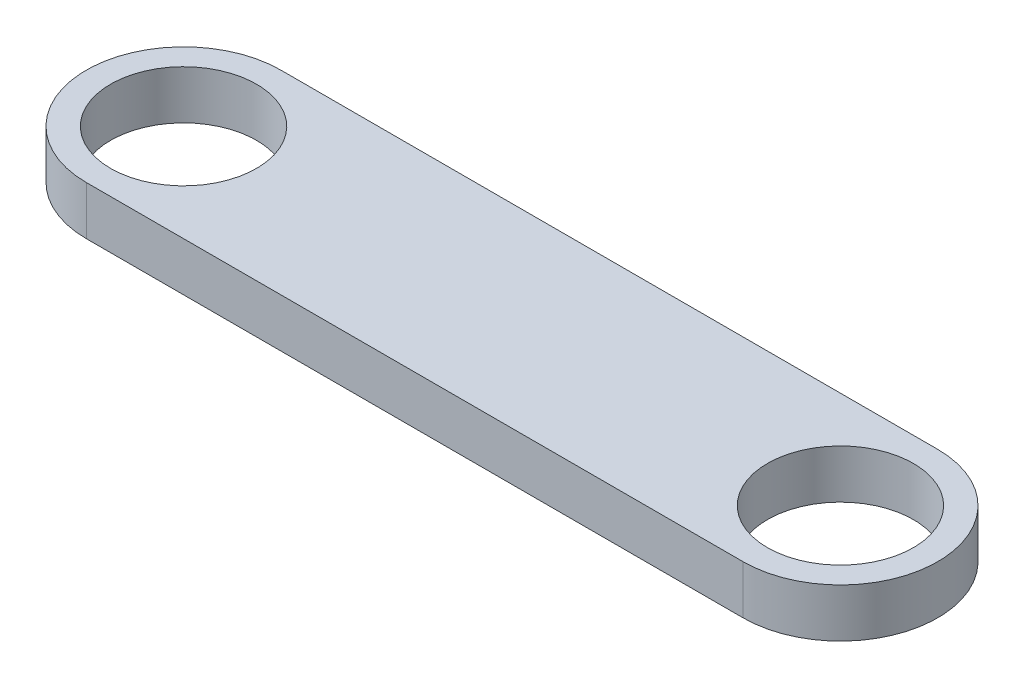
ISO-10303-21;
HEADER;
FILE_DESCRIPTION(('STEP AP214'),'2;1');
FILE_NAME('part.step','',(''),(''),'','','');
FILE_SCHEMA(('AUTOMOTIVE_DESIGN { 1 0 10303 214 1 1 1 1 }'));
ENDSEC;
DATA;
#1=APPLICATION_CONTEXT('core data for automotive mechanical design processes');
#2=APPLICATION_PROTOCOL_DEFINITION('international standard','automotive_design',2000,#1);
#3=PRODUCT_CONTEXT('',#1,'mechanical');
#4=PRODUCT('Part','Part','',(#3));
#5=PRODUCT_RELATED_PRODUCT_CATEGORY('part','',(#4));
#6=PRODUCT_DEFINITION_FORMATION('','',#4);
#7=PRODUCT_DEFINITION_CONTEXT('part definition',#1,'design');
#8=PRODUCT_DEFINITION('design','',#6,#7);
#9=PRODUCT_DEFINITION_SHAPE('','',#8);
#10=(LENGTH_UNIT() NAMED_UNIT(*) SI_UNIT(.MILLI.,.METRE.));
#11=(NAMED_UNIT(*) PLANE_ANGLE_UNIT() SI_UNIT($,.RADIAN.));
#12=(NAMED_UNIT(*) SI_UNIT($,.STERADIAN.) SOLID_ANGLE_UNIT());
#13=UNCERTAINTY_MEASURE_WITH_UNIT(LENGTH_MEASURE(1.E-05),#10,'distance_accuracy_value','');
#14=(GEOMETRIC_REPRESENTATION_CONTEXT(3) GLOBAL_UNCERTAINTY_ASSIGNED_CONTEXT((#13)) GLOBAL_UNIT_ASSIGNED_CONTEXT((#10,
#11,#12)) REPRESENTATION_CONTEXT('',''));
#15=CARTESIAN_POINT('',(0.,0.,0.));
#16=DIRECTION('',(0.,0.,1.));
#17=DIRECTION('',(1.,0.,0.));
#18=AXIS2_PLACEMENT_3D('',#15,#16,#17);
#19=CARTESIAN_POINT('',(-134.186746987952,10.,0.));
#20=DIRECTION('',(0.,1.,0.));
#21=DIRECTION('',(0.,0.,1.));
#22=AXIS2_PLACEMENT_3D('',#19,#20,#21);
#23=PLANE('',#22);
#24=CARTESIAN_POINT('',(0.813253012048182,10.,0.));
#25=DIRECTION('',(0.,1.,0.));
#26=DIRECTION('',(0.,0.,1.));
#27=AXIS2_PLACEMENT_3D('',#24,#25,#26);
#28=CIRCLE('',#27,15.);
#29=CARTESIAN_POINT('',(0.813253012048182,10.,15.));
#30=VERTEX_POINT('',#29);
#31=EDGE_CURVE('E117',#30,#30,#28,.T.);
#32=ORIENTED_EDGE('',*,*,#31,.F.);
#33=EDGE_LOOP('',(#32));
#34=FACE_BOUND('',#33,.T.);
#35=CARTESIAN_POINT('',(-134.186746987952,10.,0.));
#36=DIRECTION('',(0.,1.,0.));
#37=DIRECTION('',(0.,0.,1.));
#38=AXIS2_PLACEMENT_3D('',#35,#36,#37);
#39=CIRCLE('',#38,20.);
#40=CARTESIAN_POINT('',(-134.186746987952,10.,-20.));
#41=VERTEX_POINT('',#40);
#42=CARTESIAN_POINT('',(-134.186746987952,10.,20.));
#43=VERTEX_POINT('',#42);
#44=EDGE_CURVE('E84',#41,#43,#39,.T.);
#45=ORIENTED_EDGE('',*,*,#44,.T.);
#46=DIRECTION('',(1.,0.,0.));
#47=VECTOR('',#46,1.);
#48=CARTESIAN_POINT('',(-134.186746987952,10.,20.));
#49=LINE('',#48,#47);
#50=CARTESIAN_POINT('',(0.813253012048182,10.,20.));
#51=VERTEX_POINT('',#50);
#52=EDGE_CURVE('E79',#43,#51,#49,.T.);
#53=ORIENTED_EDGE('',*,*,#52,.T.);
#54=CARTESIAN_POINT('',(0.813253012048182,10.,0.));
#55=DIRECTION('',(0.,1.,0.));
#56=DIRECTION('',(0.,0.,1.));
#57=AXIS2_PLACEMENT_3D('',#54,#55,#56);
#58=CIRCLE('',#57,20.);
#59=CARTESIAN_POINT('',(0.813253012048182,10.,-20.));
#60=VERTEX_POINT('',#59);
#61=EDGE_CURVE('E82',#51,#60,#58,.T.);
#62=ORIENTED_EDGE('',*,*,#61,.T.);
#63=DIRECTION('',(-1.,0.,0.));
#64=VECTOR('',#63,1.);
#65=CARTESIAN_POINT('',(-134.186746987952,10.,-20.));
#66=LINE('',#65,#64);
#67=EDGE_CURVE('E49',#60,#41,#66,.T.);
#68=ORIENTED_EDGE('',*,*,#67,.T.);
#69=EDGE_LOOP('',(#45,#53,#62,#68));
#70=FACE_BOUND('',#69,.T.);
#71=CARTESIAN_POINT('',(-134.186746987952,10.,0.));
#72=DIRECTION('',(0.,1.,0.));
#73=DIRECTION('',(0.,0.,1.));
#74=AXIS2_PLACEMENT_3D('',#71,#72,#73);
#75=CIRCLE('',#74,15.);
#76=CARTESIAN_POINT('',(-134.186746987952,10.,15.));
#77=VERTEX_POINT('',#76);
#78=EDGE_CURVE('E99',#77,#77,#75,.T.);
#79=ORIENTED_EDGE('',*,*,#78,.F.);
#80=EDGE_LOOP('',(#79));
#81=FACE_BOUND('',#80,.T.);
#82=ADVANCED_FACE('F32',(#34,#70,#81),#23,.T.);
#83=CARTESIAN_POINT('',(-134.186746987952,0.,0.));
#84=DIRECTION('',(0.,1.,0.));
#85=DIRECTION('',(0.,0.,1.));
#86=AXIS2_PLACEMENT_3D('',#83,#84,#85);
#87=PLANE('',#86);
#88=CARTESIAN_POINT('',(0.813253012048182,0.,0.));
#89=DIRECTION('',(0.,1.,0.));
#90=DIRECTION('',(0.,0.,1.));
#91=AXIS2_PLACEMENT_3D('',#88,#89,#90);
#92=CIRCLE('',#91,15.);
#93=CARTESIAN_POINT('',(0.813253012048182,0.,15.));
#94=VERTEX_POINT('',#93);
#95=EDGE_CURVE('E114',#94,#94,#92,.T.);
#96=ORIENTED_EDGE('',*,*,#95,.T.);
#97=EDGE_LOOP('',(#96));
#98=FACE_BOUND('',#97,.T.);
#99=CARTESIAN_POINT('',(-134.186746987952,0.,0.));
#100=DIRECTION('',(0.,1.,0.));
#101=DIRECTION('',(0.,0.,1.));
#102=AXIS2_PLACEMENT_3D('',#99,#100,#101);
#103=CIRCLE('',#102,20.);
#104=CARTESIAN_POINT('',(-134.186746987952,0.,-20.));
#105=VERTEX_POINT('',#104);
#106=CARTESIAN_POINT('',(-134.186746987952,0.,20.));
#107=VERTEX_POINT('',#106);
#108=EDGE_CURVE('E96',#105,#107,#103,.T.);
#109=ORIENTED_EDGE('',*,*,#108,.F.);
#110=DIRECTION('',(-1.,0.,0.));
#111=VECTOR('',#110,1.);
#112=CARTESIAN_POINT('',(-134.186746987952,0.,-20.));
#113=LINE('',#112,#111);
#114=CARTESIAN_POINT('',(0.813253012048182,0.,-20.));
#115=VERTEX_POINT('',#114);
#116=EDGE_CURVE('E72',#115,#105,#113,.T.);
#117=ORIENTED_EDGE('',*,*,#116,.F.);
#118=CARTESIAN_POINT('',(0.813253012048182,0.,0.));
#119=DIRECTION('',(0.,1.,0.));
#120=DIRECTION('',(0.,0.,1.));
#121=AXIS2_PLACEMENT_3D('',#118,#119,#120);
#122=CIRCLE('',#121,20.);
#123=CARTESIAN_POINT('',(0.813253012048182,0.,20.));
#124=VERTEX_POINT('',#123);
#125=EDGE_CURVE('E66',#124,#115,#122,.T.);
#126=ORIENTED_EDGE('',*,*,#125,.F.);
#127=DIRECTION('',(1.,0.,0.));
#128=VECTOR('',#127,1.);
#129=CARTESIAN_POINT('',(-134.186746987952,0.,20.));
#130=LINE('',#129,#128);
#131=EDGE_CURVE('E88',#107,#124,#130,.T.);
#132=ORIENTED_EDGE('',*,*,#131,.F.);
#133=EDGE_LOOP('',(#109,#117,#126,#132));
#134=FACE_BOUND('',#133,.T.);
#135=CARTESIAN_POINT('',(-134.186746987952,0.,0.));
#136=DIRECTION('',(0.,1.,0.));
#137=DIRECTION('',(0.,0.,1.));
#138=AXIS2_PLACEMENT_3D('',#135,#136,#137);
#139=CIRCLE('',#138,15.);
#140=CARTESIAN_POINT('',(-134.186746987952,0.,15.));
#141=VERTEX_POINT('',#140);
#142=EDGE_CURVE('E111',#141,#141,#139,.T.);
#143=ORIENTED_EDGE('',*,*,#142,.T.);
#144=EDGE_LOOP('',(#143));
#145=FACE_BOUND('',#144,.T.);
#146=ADVANCED_FACE('F107',(#98,#134,#145),#87,.F.);
#147=CARTESIAN_POINT('',(-134.186746987952,10.,0.));
#148=DIRECTION('',(0.,-1.,0.));
#149=DIRECTION('',(0.,0.,-1.));
#150=AXIS2_PLACEMENT_3D('',#147,#148,#149);
#151=CYLINDRICAL_SURFACE('',#150,20.);
#152=ORIENTED_EDGE('',*,*,#108,.T.);
#153=DIRECTION('',(0.,-1.,0.));
#154=VECTOR('',#153,1.);
#155=CARTESIAN_POINT('',(-134.186746987952,10.,20.));
#156=LINE('',#155,#154);
#157=EDGE_CURVE('E11',#43,#107,#156,.T.);
#158=ORIENTED_EDGE('',*,*,#157,.F.);
#159=ORIENTED_EDGE('',*,*,#44,.F.);
#160=DIRECTION('',(0.,-1.,0.));
#161=VECTOR('',#160,1.);
#162=CARTESIAN_POINT('',(-134.186746987952,10.,-20.));
#163=LINE('',#162,#161);
#164=EDGE_CURVE('E92',#41,#105,#163,.T.);
#165=ORIENTED_EDGE('',*,*,#164,.T.);
#166=EDGE_LOOP('',(#152,#158,#159,#165));
#167=FACE_BOUND('',#166,.T.);
#168=ADVANCED_FACE('F34',(#167),#151,.T.);
#169=CARTESIAN_POINT('',(-134.186746987952,10.,20.));
#170=DIRECTION('',(0.,0.,-1.));
#171=DIRECTION('',(-1.,0.,0.));
#172=AXIS2_PLACEMENT_3D('',#169,#170,#171);
#173=PLANE('',#172);
#174=ORIENTED_EDGE('',*,*,#131,.T.);
#175=DIRECTION('',(0.,-1.,0.));
#176=VECTOR('',#175,1.);
#177=CARTESIAN_POINT('',(0.813253012048182,10.,20.));
#178=LINE('',#177,#176);
#179=EDGE_CURVE('E41',#51,#124,#178,.T.);
#180=ORIENTED_EDGE('',*,*,#179,.F.);
#181=ORIENTED_EDGE('',*,*,#52,.F.);
#182=ORIENTED_EDGE('',*,*,#157,.T.);
#183=EDGE_LOOP('',(#174,#180,#181,#182));
#184=FACE_BOUND('',#183,.T.);
#185=ADVANCED_FACE('F87',(#184),#173,.F.);
#186=CARTESIAN_POINT('',(0.813253012048182,10.,0.));
#187=DIRECTION('',(0.,-1.,0.));
#188=DIRECTION('',(0.,0.,-1.));
#189=AXIS2_PLACEMENT_3D('',#186,#187,#188);
#190=CYLINDRICAL_SURFACE('',#189,20.);
#191=ORIENTED_EDGE('',*,*,#125,.T.);
#192=DIRECTION('',(0.,-1.,0.));
#193=VECTOR('',#192,1.);
#194=CARTESIAN_POINT('',(0.813253012048182,10.,-20.));
#195=LINE('',#194,#193);
#196=EDGE_CURVE('E89',#60,#115,#195,.T.);
#197=ORIENTED_EDGE('',*,*,#196,.F.);
#198=ORIENTED_EDGE('',*,*,#61,.F.);
#199=ORIENTED_EDGE('',*,*,#179,.T.);
#200=EDGE_LOOP('',(#191,#197,#198,#199));
#201=FACE_BOUND('',#200,.T.);
#202=ADVANCED_FACE('F90',(#201),#190,.T.);
#203=CARTESIAN_POINT('',(-134.186746987952,10.,-20.));
#204=DIRECTION('',(0.,0.,1.));
#205=DIRECTION('',(1.,0.,0.));
#206=AXIS2_PLACEMENT_3D('',#203,#204,#205);
#207=PLANE('',#206);
#208=ORIENTED_EDGE('',*,*,#116,.T.);
#209=ORIENTED_EDGE('',*,*,#164,.F.);
#210=ORIENTED_EDGE('',*,*,#67,.F.);
#211=ORIENTED_EDGE('',*,*,#196,.T.);
#212=EDGE_LOOP('',(#208,#209,#210,#211));
#213=FACE_BOUND('',#212,.T.);
#214=ADVANCED_FACE('F104',(#213),#207,.F.);
#215=CARTESIAN_POINT('',(-134.186746987952,10.,0.));
#216=DIRECTION('',(0.,-1.,0.));
#217=DIRECTION('',(0.,0.,-1.));
#218=AXIS2_PLACEMENT_3D('',#215,#216,#217);
#219=CYLINDRICAL_SURFACE('',#218,15.);
#220=ORIENTED_EDGE('',*,*,#78,.T.);
#221=EDGE_LOOP('',(#220));
#222=FACE_BOUND('',#221,.T.);
#223=ORIENTED_EDGE('',*,*,#142,.F.);
#224=EDGE_LOOP('',(#223));
#225=FACE_BOUND('',#224,.T.);
#226=ADVANCED_FACE('F127',(#222,#225),#219,.F.);
#227=CARTESIAN_POINT('',(0.813253012048182,0.,0.));
#228=DIRECTION('',(0.,1.,0.));
#229=DIRECTION('',(0.,0.,1.));
#230=AXIS2_PLACEMENT_3D('',#227,#228,#229);
#231=CYLINDRICAL_SURFACE('',#230,15.);
#232=ORIENTED_EDGE('',*,*,#95,.F.);
#233=EDGE_LOOP('',(#232));
#234=FACE_BOUND('',#233,.T.);
#235=ORIENTED_EDGE('',*,*,#31,.T.);
#236=EDGE_LOOP('',(#235));
#237=FACE_BOUND('',#236,.T.);
#238=ADVANCED_FACE('F124',(#234,#237),#231,.F.);
#239=CLOSED_SHELL('',(#82,#146,#168,#185,#202,#214,#226,#238));
#240=MANIFOLD_SOLID_BREP('B2',#239);
#241=ADVANCED_BREP_SHAPE_REPRESENTATION('',(#18,#240),#14);
#242=SHAPE_DEFINITION_REPRESENTATION(#9,#241);
ENDSEC;
END-ISO-10303-21;
